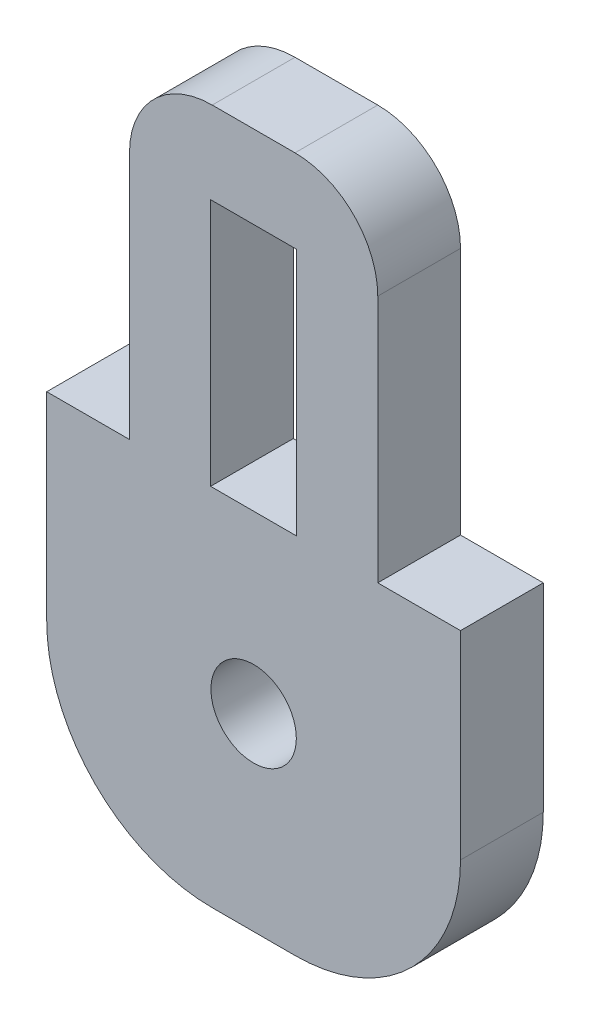
ISO-10303-21;
HEADER;
FILE_DESCRIPTION(('STEP AP214'),'2;1');
FILE_NAME('part.step','',(''),(''),'','','');
FILE_SCHEMA(('AUTOMOTIVE_DESIGN { 1 0 10303 214 1 1 1 1 }'));
ENDSEC;
DATA;
#1=APPLICATION_CONTEXT('core data for automotive mechanical design processes');
#2=APPLICATION_PROTOCOL_DEFINITION('international standard','automotive_design',2000,#1);
#3=PRODUCT_CONTEXT('',#1,'mechanical');
#4=PRODUCT('Part','Part','',(#3));
#5=PRODUCT_RELATED_PRODUCT_CATEGORY('part','',(#4));
#6=PRODUCT_DEFINITION_FORMATION('','',#4);
#7=PRODUCT_DEFINITION_CONTEXT('part definition',#1,'design');
#8=PRODUCT_DEFINITION('design','',#6,#7);
#9=PRODUCT_DEFINITION_SHAPE('','',#8);
#10=(LENGTH_UNIT() NAMED_UNIT(*) SI_UNIT(.MILLI.,.METRE.));
#11=(NAMED_UNIT(*) PLANE_ANGLE_UNIT() SI_UNIT($,.RADIAN.));
#12=(NAMED_UNIT(*) SI_UNIT($,.STERADIAN.) SOLID_ANGLE_UNIT());
#13=UNCERTAINTY_MEASURE_WITH_UNIT(LENGTH_MEASURE(1.E-05),#10,'distance_accuracy_value','');
#14=(GEOMETRIC_REPRESENTATION_CONTEXT(3) GLOBAL_UNCERTAINTY_ASSIGNED_CONTEXT((#13)) GLOBAL_UNIT_ASSIGNED_CONTEXT((#10,
#11,#12)) REPRESENTATION_CONTEXT('',''));
#15=CARTESIAN_POINT('',(0.,0.,0.));
#16=DIRECTION('',(0.,0.,1.));
#17=DIRECTION('',(1.,0.,0.));
#18=AXIS2_PLACEMENT_3D('',#15,#16,#17);
#19=CARTESIAN_POINT('',(-1.5875,16.51,3.175));
#20=DIRECTION('',(0.,0.,-1.));
#21=DIRECTION('',(-1.,0.,0.));
#22=AXIS2_PLACEMENT_3D('',#19,#20,#21);
#23=PLANE('',#22);
#24=DIRECTION('',(0.,1.,0.));
#25=VECTOR('',#24,1.);
#26=CARTESIAN_POINT('',(1.651,6.985,3.175));
#27=LINE('',#26,#25);
#28=CARTESIAN_POINT('',(1.651,6.985,3.175));
#29=VERTEX_POINT('',#28);
#30=CARTESIAN_POINT('',(1.651,16.51,3.175));
#31=VERTEX_POINT('',#30);
#32=EDGE_CURVE('E149',#29,#31,#27,.T.);
#33=ORIENTED_EDGE('',*,*,#32,.F.);
#34=DIRECTION('',(1.,0.,0.));
#35=VECTOR('',#34,1.);
#36=CARTESIAN_POINT('',(-1.651,6.985,3.175));
#37=LINE('',#36,#35);
#38=CARTESIAN_POINT('',(-1.651,6.985,3.175));
#39=VERTEX_POINT('',#38);
#40=EDGE_CURVE('E172',#39,#29,#37,.T.);
#41=ORIENTED_EDGE('',*,*,#40,.F.);
#42=DIRECTION('',(0.,-1.,0.));
#43=VECTOR('',#42,1.);
#44=CARTESIAN_POINT('',(-1.651,6.985,3.175));
#45=LINE('',#44,#43);
#46=CARTESIAN_POINT('',(-1.651,16.51,3.175));
#47=VERTEX_POINT('',#46);
#48=EDGE_CURVE('E170',#47,#39,#45,.T.);
#49=ORIENTED_EDGE('',*,*,#48,.F.);
#50=DIRECTION('',(-1.,0.,0.));
#51=VECTOR('',#50,1.);
#52=CARTESIAN_POINT('',(-1.651,16.51,3.175));
#53=LINE('',#52,#51);
#54=EDGE_CURVE('E157',#31,#47,#53,.T.);
#55=ORIENTED_EDGE('',*,*,#54,.F.);
#56=EDGE_LOOP('',(#33,#41,#49,#55));
#57=FACE_BOUND('',#56,.T.);
#58=DIRECTION('',(-1.,0.,0.));
#59=VECTOR('',#58,1.);
#60=CARTESIAN_POINT('',(-7.9375,6.985,3.175));
#61=LINE('',#60,#59);
#62=CARTESIAN_POINT('',(-4.7625,6.98499999999999,3.175));
#63=VERTEX_POINT('',#62);
#64=CARTESIAN_POINT('',(-7.9375,6.985,3.175));
#65=VERTEX_POINT('',#64);
#66=EDGE_CURVE('E201',#63,#65,#61,.T.);
#67=ORIENTED_EDGE('',*,*,#66,.T.);
#68=DIRECTION('',(0.,-1.,0.));
#69=VECTOR('',#68,1.);
#70=CARTESIAN_POINT('',(-7.9375,6.985,3.175));
#71=LINE('',#70,#69);
#72=CARTESIAN_POINT('',(-7.9375,-0.635000000000001,3.175));
#73=VERTEX_POINT('',#72);
#74=EDGE_CURVE('E204',#65,#73,#71,.T.);
#75=ORIENTED_EDGE('',*,*,#74,.T.);
#76=CARTESIAN_POINT('',(-1.5875,-0.635000000000001,3.175));
#77=DIRECTION('',(0.,0.,1.));
#78=DIRECTION('',(1.,0.,0.));
#79=AXIS2_PLACEMENT_3D('',#76,#77,#78);
#80=CIRCLE('',#79,6.35);
#81=CARTESIAN_POINT('',(-1.5875,-6.985,3.175));
#82=VERTEX_POINT('',#81);
#83=EDGE_CURVE('E207',#73,#82,#80,.T.);
#84=ORIENTED_EDGE('',*,*,#83,.T.);
#85=DIRECTION('',(1.,0.,0.));
#86=VECTOR('',#85,1.);
#87=CARTESIAN_POINT('',(-1.5875,-6.985,3.175));
#88=LINE('',#87,#86);
#89=CARTESIAN_POINT('',(1.5875,-6.985,3.175));
#90=VERTEX_POINT('',#89);
#91=EDGE_CURVE('E209',#82,#90,#88,.T.);
#92=ORIENTED_EDGE('',*,*,#91,.T.);
#93=CARTESIAN_POINT('',(1.5875,-0.635000000000001,3.175));
#94=DIRECTION('',(0.,0.,1.));
#95=DIRECTION('',(1.,0.,0.));
#96=AXIS2_PLACEMENT_3D('',#93,#94,#95);
#97=CIRCLE('',#96,6.35);
#98=CARTESIAN_POINT('',(7.9375,-0.635000000000001,3.175));
#99=VERTEX_POINT('',#98);
#100=EDGE_CURVE('E211',#90,#99,#97,.T.);
#101=ORIENTED_EDGE('',*,*,#100,.T.);
#102=DIRECTION('',(0.,1.,0.));
#103=VECTOR('',#102,1.);
#104=CARTESIAN_POINT('',(7.9375,6.985,3.175));
#105=LINE('',#104,#103);
#106=CARTESIAN_POINT('',(7.9375,6.985,3.175));
#107=VERTEX_POINT('',#106);
#108=EDGE_CURVE('E213',#99,#107,#105,.T.);
#109=ORIENTED_EDGE('',*,*,#108,.T.);
#110=DIRECTION('',(-1.,0.,0.));
#111=VECTOR('',#110,1.);
#112=CARTESIAN_POINT('',(7.9375,6.985,3.175));
#113=LINE('',#112,#111);
#114=CARTESIAN_POINT('',(4.7625,6.985,3.175));
#115=VERTEX_POINT('',#114);
#116=EDGE_CURVE('E215',#107,#115,#113,.T.);
#117=ORIENTED_EDGE('',*,*,#116,.T.);
#118=DIRECTION('',(0.,1.,0.));
#119=VECTOR('',#118,1.);
#120=CARTESIAN_POINT('',(4.7625,6.985,3.175));
#121=LINE('',#120,#119);
#122=CARTESIAN_POINT('',(4.7625,16.51,3.175));
#123=VERTEX_POINT('',#122);
#124=EDGE_CURVE('E217',#115,#123,#121,.T.);
#125=ORIENTED_EDGE('',*,*,#124,.T.);
#126=CARTESIAN_POINT('',(1.5875,16.51,3.175));
#127=DIRECTION('',(0.,0.,1.));
#128=DIRECTION('',(-1.,0.,0.));
#129=AXIS2_PLACEMENT_3D('',#126,#127,#128);
#130=CIRCLE('',#129,3.175);
#131=CARTESIAN_POINT('',(1.5875,19.685,3.175));
#132=VERTEX_POINT('',#131);
#133=EDGE_CURVE('E219',#123,#132,#130,.T.);
#134=ORIENTED_EDGE('',*,*,#133,.T.);
#135=DIRECTION('',(-1.,0.,0.));
#136=VECTOR('',#135,1.);
#137=CARTESIAN_POINT('',(-1.5875,19.685,3.175));
#138=LINE('',#137,#136);
#139=CARTESIAN_POINT('',(-1.5875,19.685,3.175));
#140=VERTEX_POINT('',#139);
#141=EDGE_CURVE('E221',#132,#140,#138,.T.);
#142=ORIENTED_EDGE('',*,*,#141,.T.);
#143=CARTESIAN_POINT('',(-1.5875,16.51,3.175));
#144=DIRECTION('',(0.,0.,1.));
#145=DIRECTION('',(-1.,0.,0.));
#146=AXIS2_PLACEMENT_3D('',#143,#144,#145);
#147=CIRCLE('',#146,3.175);
#148=CARTESIAN_POINT('',(-4.7625,16.51,3.175));
#149=VERTEX_POINT('',#148);
#150=EDGE_CURVE('E223',#140,#149,#147,.T.);
#151=ORIENTED_EDGE('',*,*,#150,.T.);
#152=DIRECTION('',(0.,-1.,0.));
#153=VECTOR('',#152,1.);
#154=CARTESIAN_POINT('',(-4.7625,6.98499999999999,3.175));
#155=LINE('',#154,#153);
#156=EDGE_CURVE('E225',#149,#63,#155,.T.);
#157=ORIENTED_EDGE('',*,*,#156,.T.);
#158=EDGE_LOOP('',(#67,#75,#84,#92,#101,#109,#117,#125,#134,#142,#151,#157));
#159=FACE_BOUND('',#158,.T.);
#160=CARTESIAN_POINT('',(0.,0.254000000000001,3.175));
#161=DIRECTION('',(0.,0.,1.));
#162=DIRECTION('',(1.,0.,0.));
#163=AXIS2_PLACEMENT_3D('',#160,#161,#162);
#164=CIRCLE('',#163,1.6383);
#165=CARTESIAN_POINT('',(1.6383,0.254000000000001,3.175));
#166=VERTEX_POINT('',#165);
#167=EDGE_CURVE('E179',#166,#166,#164,.T.);
#168=ORIENTED_EDGE('',*,*,#167,.F.);
#169=EDGE_LOOP('',(#168));
#170=FACE_BOUND('',#169,.T.);
#171=ADVANCED_FACE('F36',(#57,#159,#170),#23,.F.);
#172=CARTESIAN_POINT('',(-1.5875,16.51,0.));
#173=DIRECTION('',(0.,0.,-1.));
#174=DIRECTION('',(-1.,0.,0.));
#175=AXIS2_PLACEMENT_3D('',#172,#173,#174);
#176=PLANE('',#175);
#177=DIRECTION('',(1.,0.,0.));
#178=VECTOR('',#177,1.);
#179=CARTESIAN_POINT('',(-1.651,6.985,0.));
#180=LINE('',#179,#178);
#181=CARTESIAN_POINT('',(-1.651,6.985,0.));
#182=VERTEX_POINT('',#181);
#183=CARTESIAN_POINT('',(1.651,6.985,0.));
#184=VERTEX_POINT('',#183);
#185=EDGE_CURVE('E158',#182,#184,#180,.T.);
#186=ORIENTED_EDGE('',*,*,#185,.T.);
#187=DIRECTION('',(0.,1.,0.));
#188=VECTOR('',#187,1.);
#189=CARTESIAN_POINT('',(1.651,6.985,0.));
#190=LINE('',#189,#188);
#191=CARTESIAN_POINT('',(1.651,16.51,0.));
#192=VERTEX_POINT('',#191);
#193=EDGE_CURVE('E59',#184,#192,#190,.T.);
#194=ORIENTED_EDGE('',*,*,#193,.T.);
#195=DIRECTION('',(-1.,0.,0.));
#196=VECTOR('',#195,1.);
#197=CARTESIAN_POINT('',(-1.651,16.51,0.));
#198=LINE('',#197,#196);
#199=CARTESIAN_POINT('',(-1.651,16.51,0.));
#200=VERTEX_POINT('',#199);
#201=EDGE_CURVE('E164',#192,#200,#198,.T.);
#202=ORIENTED_EDGE('',*,*,#201,.T.);
#203=DIRECTION('',(0.,-1.,0.));
#204=VECTOR('',#203,1.);
#205=CARTESIAN_POINT('',(-1.651,6.985,0.));
#206=LINE('',#205,#204);
#207=EDGE_CURVE('E190',#200,#182,#206,.T.);
#208=ORIENTED_EDGE('',*,*,#207,.T.);
#209=EDGE_LOOP('',(#186,#194,#202,#208));
#210=FACE_BOUND('',#209,.T.);
#211=DIRECTION('',(-1.,0.,0.));
#212=VECTOR('',#211,1.);
#213=CARTESIAN_POINT('',(-7.9375,6.985,0.));
#214=LINE('',#213,#212);
#215=CARTESIAN_POINT('',(-4.7625,6.98499999999999,0.));
#216=VERTEX_POINT('',#215);
#217=CARTESIAN_POINT('',(-7.9375,6.985,0.));
#218=VERTEX_POINT('',#217);
#219=EDGE_CURVE('E165',#216,#218,#214,.T.);
#220=ORIENTED_EDGE('',*,*,#219,.F.);
#221=DIRECTION('',(0.,-1.,0.));
#222=VECTOR('',#221,1.);
#223=CARTESIAN_POINT('',(-4.7625,6.98499999999999,0.));
#224=LINE('',#223,#222);
#225=CARTESIAN_POINT('',(-4.7625,16.51,0.));
#226=VERTEX_POINT('',#225);
#227=EDGE_CURVE('E205',#226,#216,#224,.T.);
#228=ORIENTED_EDGE('',*,*,#227,.F.);
#229=CARTESIAN_POINT('',(-1.5875,16.51,0.));
#230=DIRECTION('',(0.,0.,1.));
#231=DIRECTION('',(-1.,0.,0.));
#232=AXIS2_PLACEMENT_3D('',#229,#230,#231);
#233=CIRCLE('',#232,3.175);
#234=CARTESIAN_POINT('',(-1.5875,19.685,0.));
#235=VERTEX_POINT('',#234);
#236=EDGE_CURVE('E273',#235,#226,#233,.T.);
#237=ORIENTED_EDGE('',*,*,#236,.F.);
#238=DIRECTION('',(-1.,0.,0.));
#239=VECTOR('',#238,1.);
#240=CARTESIAN_POINT('',(-1.5875,19.685,0.));
#241=LINE('',#240,#239);
#242=CARTESIAN_POINT('',(1.5875,19.685,0.));
#243=VERTEX_POINT('',#242);
#244=EDGE_CURVE('E269',#243,#235,#241,.T.);
#245=ORIENTED_EDGE('',*,*,#244,.F.);
#246=CARTESIAN_POINT('',(1.5875,16.51,0.));
#247=DIRECTION('',(0.,0.,1.));
#248=DIRECTION('',(-1.,0.,0.));
#249=AXIS2_PLACEMENT_3D('',#246,#247,#248);
#250=CIRCLE('',#249,3.175);
#251=CARTESIAN_POINT('',(4.7625,16.51,0.));
#252=VERTEX_POINT('',#251);
#253=EDGE_CURVE('E265',#252,#243,#250,.T.);
#254=ORIENTED_EDGE('',*,*,#253,.F.);
#255=DIRECTION('',(0.,1.,0.));
#256=VECTOR('',#255,1.);
#257=CARTESIAN_POINT('',(4.7625,6.985,0.));
#258=LINE('',#257,#256);
#259=CARTESIAN_POINT('',(4.7625,6.985,0.));
#260=VERTEX_POINT('',#259);
#261=EDGE_CURVE('E262',#260,#252,#258,.T.);
#262=ORIENTED_EDGE('',*,*,#261,.F.);
#263=DIRECTION('',(-1.,0.,0.));
#264=VECTOR('',#263,1.);
#265=CARTESIAN_POINT('',(7.9375,6.985,0.));
#266=LINE('',#265,#264);
#267=CARTESIAN_POINT('',(7.9375,6.985,0.));
#268=VERTEX_POINT('',#267);
#269=EDGE_CURVE('E254',#268,#260,#266,.T.);
#270=ORIENTED_EDGE('',*,*,#269,.F.);
#271=DIRECTION('',(0.,1.,0.));
#272=VECTOR('',#271,1.);
#273=CARTESIAN_POINT('',(7.9375,6.985,0.));
#274=LINE('',#273,#272);
#275=CARTESIAN_POINT('',(7.9375,-0.635000000000001,0.));
#276=VERTEX_POINT('',#275);
#277=EDGE_CURVE('E250',#276,#268,#274,.T.);
#278=ORIENTED_EDGE('',*,*,#277,.F.);
#279=CARTESIAN_POINT('',(1.5875,-0.635000000000001,0.));
#280=DIRECTION('',(0.,0.,1.));
#281=DIRECTION('',(1.,0.,0.));
#282=AXIS2_PLACEMENT_3D('',#279,#280,#281);
#283=CIRCLE('',#282,6.35);
#284=CARTESIAN_POINT('',(1.5875,-6.985,0.));
#285=VERTEX_POINT('',#284);
#286=EDGE_CURVE('E246',#285,#276,#283,.T.);
#287=ORIENTED_EDGE('',*,*,#286,.F.);
#288=DIRECTION('',(1.,0.,0.));
#289=VECTOR('',#288,1.);
#290=CARTESIAN_POINT('',(-1.5875,-6.985,0.));
#291=LINE('',#290,#289);
#292=CARTESIAN_POINT('',(-1.5875,-6.985,0.));
#293=VERTEX_POINT('',#292);
#294=EDGE_CURVE('E243',#293,#285,#291,.T.);
#295=ORIENTED_EDGE('',*,*,#294,.F.);
#296=CARTESIAN_POINT('',(-1.5875,-0.635000000000001,0.));
#297=DIRECTION('',(0.,0.,1.));
#298=DIRECTION('',(1.,0.,0.));
#299=AXIS2_PLACEMENT_3D('',#296,#297,#298);
#300=CIRCLE('',#299,6.35);
#301=CARTESIAN_POINT('',(-7.9375,-0.635000000000001,0.));
#302=VERTEX_POINT('',#301);
#303=EDGE_CURVE('E235',#302,#293,#300,.T.);
#304=ORIENTED_EDGE('',*,*,#303,.F.);
#305=DIRECTION('',(0.,-1.,0.));
#306=VECTOR('',#305,1.);
#307=CARTESIAN_POINT('',(-7.9375,6.985,0.));
#308=LINE('',#307,#306);
#309=EDGE_CURVE('E231',#218,#302,#308,.T.);
#310=ORIENTED_EDGE('',*,*,#309,.F.);
#311=EDGE_LOOP('',(#220,#228,#237,#245,#254,#262,#270,#278,#287,#295,#304,#310));
#312=FACE_BOUND('',#311,.T.);
#313=CARTESIAN_POINT('',(0.,0.254000000000001,0.));
#314=DIRECTION('',(0.,0.,1.));
#315=DIRECTION('',(1.,0.,0.));
#316=AXIS2_PLACEMENT_3D('',#313,#314,#315);
#317=CIRCLE('',#316,1.6383);
#318=CARTESIAN_POINT('',(1.6383,0.254000000000001,0.));
#319=VERTEX_POINT('',#318);
#320=EDGE_CURVE('E324',#319,#319,#317,.T.);
#321=ORIENTED_EDGE('',*,*,#320,.T.);
#322=EDGE_LOOP('',(#321));
#323=FACE_BOUND('',#322,.T.);
#324=ADVANCED_FACE('F319',(#210,#312,#323),#176,.T.);
#325=CARTESIAN_POINT('',(-7.9375,6.985,3.175));
#326=DIRECTION('',(0.,-1.,0.));
#327=DIRECTION('',(1.,0.,0.));
#328=AXIS2_PLACEMENT_3D('',#325,#326,#327);
#329=PLANE('',#328);
#330=ORIENTED_EDGE('',*,*,#219,.T.);
#331=DIRECTION('',(0.,0.,-1.));
#332=VECTOR('',#331,1.);
#333=CARTESIAN_POINT('',(-7.9375,6.985,3.175));
#334=LINE('',#333,#332);
#335=EDGE_CURVE('E12',#65,#218,#334,.T.);
#336=ORIENTED_EDGE('',*,*,#335,.F.);
#337=ORIENTED_EDGE('',*,*,#66,.F.);
#338=DIRECTION('',(0.,0.,-1.));
#339=VECTOR('',#338,1.);
#340=CARTESIAN_POINT('',(-4.7625,6.98499999999999,3.175));
#341=LINE('',#340,#339);
#342=EDGE_CURVE('E226',#63,#216,#341,.T.);
#343=ORIENTED_EDGE('',*,*,#342,.T.);
#344=EDGE_LOOP('',(#330,#336,#337,#343));
#345=FACE_BOUND('',#344,.T.);
#346=ADVANCED_FACE('F38',(#345),#329,.F.);
#347=CARTESIAN_POINT('',(-7.9375,6.985,3.175));
#348=DIRECTION('',(1.,0.,0.));
#349=DIRECTION('',(0.,0.,-1.));
#350=AXIS2_PLACEMENT_3D('',#347,#348,#349);
#351=PLANE('',#350);
#352=ORIENTED_EDGE('',*,*,#309,.T.);
#353=DIRECTION('',(0.,0.,-1.));
#354=VECTOR('',#353,1.);
#355=CARTESIAN_POINT('',(-7.9375,-0.635000000000001,3.175));
#356=LINE('',#355,#354);
#357=EDGE_CURVE('E44',#73,#302,#356,.T.);
#358=ORIENTED_EDGE('',*,*,#357,.F.);
#359=ORIENTED_EDGE('',*,*,#74,.F.);
#360=ORIENTED_EDGE('',*,*,#335,.T.);
#361=EDGE_LOOP('',(#352,#358,#359,#360));
#362=FACE_BOUND('',#361,.T.);
#363=ADVANCED_FACE('F382',(#362),#351,.F.);
#364=CARTESIAN_POINT('',(-1.5875,-0.635000000000001,3.175));
#365=DIRECTION('',(0.,0.,-1.));
#366=DIRECTION('',(-1.,0.,0.));
#367=AXIS2_PLACEMENT_3D('',#364,#365,#366);
#368=CYLINDRICAL_SURFACE('',#367,6.35);
#369=ORIENTED_EDGE('',*,*,#303,.T.);
#370=DIRECTION('',(0.,0.,-1.));
#371=VECTOR('',#370,1.);
#372=CARTESIAN_POINT('',(-1.5875,-6.985,3.175));
#373=LINE('',#372,#371);
#374=EDGE_CURVE('E306',#82,#293,#373,.T.);
#375=ORIENTED_EDGE('',*,*,#374,.F.);
#376=ORIENTED_EDGE('',*,*,#83,.F.);
#377=ORIENTED_EDGE('',*,*,#357,.T.);
#378=EDGE_LOOP('',(#369,#375,#376,#377));
#379=FACE_BOUND('',#378,.T.);
#380=ADVANCED_FACE('F313',(#379),#368,.T.);
#381=CARTESIAN_POINT('',(-1.5875,-6.985,3.175));
#382=DIRECTION('',(0.,1.,0.));
#383=DIRECTION('',(0.,0.,1.));
#384=AXIS2_PLACEMENT_3D('',#381,#382,#383);
#385=PLANE('',#384);
#386=ORIENTED_EDGE('',*,*,#294,.T.);
#387=DIRECTION('',(0.,0.,-1.));
#388=VECTOR('',#387,1.);
#389=CARTESIAN_POINT('',(1.5875,-6.985,3.175));
#390=LINE('',#389,#388);
#391=EDGE_CURVE('E303',#90,#285,#390,.T.);
#392=ORIENTED_EDGE('',*,*,#391,.F.);
#393=ORIENTED_EDGE('',*,*,#91,.F.);
#394=ORIENTED_EDGE('',*,*,#374,.T.);
#395=EDGE_LOOP('',(#386,#392,#393,#394));
#396=FACE_BOUND('',#395,.T.);
#397=ADVANCED_FACE('F376',(#396),#385,.F.);
#398=CARTESIAN_POINT('',(1.5875,-0.635000000000001,3.175));
#399=DIRECTION('',(0.,0.,-1.));
#400=DIRECTION('',(-1.,0.,0.));
#401=AXIS2_PLACEMENT_3D('',#398,#399,#400);
#402=CYLINDRICAL_SURFACE('',#401,6.35);
#403=ORIENTED_EDGE('',*,*,#286,.T.);
#404=DIRECTION('',(0.,0.,-1.));
#405=VECTOR('',#404,1.);
#406=CARTESIAN_POINT('',(7.9375,-0.635000000000001,3.175));
#407=LINE('',#406,#405);
#408=EDGE_CURVE('E300',#99,#276,#407,.T.);
#409=ORIENTED_EDGE('',*,*,#408,.F.);
#410=ORIENTED_EDGE('',*,*,#100,.F.);
#411=ORIENTED_EDGE('',*,*,#391,.T.);
#412=EDGE_LOOP('',(#403,#409,#410,#411));
#413=FACE_BOUND('',#412,.T.);
#414=ADVANCED_FACE('F372',(#413),#402,.T.);
#415=CARTESIAN_POINT('',(7.9375,6.985,3.175));
#416=DIRECTION('',(-1.,0.,0.));
#417=DIRECTION('',(0.,0.,1.));
#418=AXIS2_PLACEMENT_3D('',#415,#416,#417);
#419=PLANE('',#418);
#420=ORIENTED_EDGE('',*,*,#277,.T.);
#421=DIRECTION('',(0.,0.,-1.));
#422=VECTOR('',#421,1.);
#423=CARTESIAN_POINT('',(7.9375,6.985,3.175));
#424=LINE('',#423,#422);
#425=EDGE_CURVE('E297',#107,#268,#424,.T.);
#426=ORIENTED_EDGE('',*,*,#425,.F.);
#427=ORIENTED_EDGE('',*,*,#108,.F.);
#428=ORIENTED_EDGE('',*,*,#408,.T.);
#429=EDGE_LOOP('',(#420,#426,#427,#428));
#430=FACE_BOUND('',#429,.T.);
#431=ADVANCED_FACE('F368',(#430),#419,.F.);
#432=CARTESIAN_POINT('',(7.9375,6.985,3.175));
#433=DIRECTION('',(0.,-1.,0.));
#434=DIRECTION('',(1.,0.,0.));
#435=AXIS2_PLACEMENT_3D('',#432,#433,#434);
#436=PLANE('',#435);
#437=ORIENTED_EDGE('',*,*,#269,.T.);
#438=DIRECTION('',(0.,0.,-1.));
#439=VECTOR('',#438,1.);
#440=CARTESIAN_POINT('',(4.7625,6.985,3.175));
#441=LINE('',#440,#439);
#442=EDGE_CURVE('E294',#115,#260,#441,.T.);
#443=ORIENTED_EDGE('',*,*,#442,.F.);
#444=ORIENTED_EDGE('',*,*,#116,.F.);
#445=ORIENTED_EDGE('',*,*,#425,.T.);
#446=EDGE_LOOP('',(#437,#443,#444,#445));
#447=FACE_BOUND('',#446,.T.);
#448=ADVANCED_FACE('F364',(#447),#436,.F.);
#449=CARTESIAN_POINT('',(4.7625,6.985,3.175));
#450=DIRECTION('',(-1.,0.,0.));
#451=DIRECTION('',(0.,-1.,0.));
#452=AXIS2_PLACEMENT_3D('',#449,#450,#451);
#453=PLANE('',#452);
#454=ORIENTED_EDGE('',*,*,#261,.T.);
#455=DIRECTION('',(0.,0.,-1.));
#456=VECTOR('',#455,1.);
#457=CARTESIAN_POINT('',(4.7625,16.51,3.175));
#458=LINE('',#457,#456);
#459=EDGE_CURVE('E291',#123,#252,#458,.T.);
#460=ORIENTED_EDGE('',*,*,#459,.F.);
#461=ORIENTED_EDGE('',*,*,#124,.F.);
#462=ORIENTED_EDGE('',*,*,#442,.T.);
#463=EDGE_LOOP('',(#454,#460,#461,#462));
#464=FACE_BOUND('',#463,.T.);
#465=ADVANCED_FACE('F360',(#464),#453,.F.);
#466=CARTESIAN_POINT('',(1.5875,16.51,3.175));
#467=DIRECTION('',(0.,0.,-1.));
#468=DIRECTION('',(-1.,0.,0.));
#469=AXIS2_PLACEMENT_3D('',#466,#467,#468);
#470=CYLINDRICAL_SURFACE('',#469,3.175);
#471=ORIENTED_EDGE('',*,*,#253,.T.);
#472=DIRECTION('',(0.,0.,-1.));
#473=VECTOR('',#472,1.);
#474=CARTESIAN_POINT('',(1.5875,19.685,3.175));
#475=LINE('',#474,#473);
#476=EDGE_CURVE('E288',#132,#243,#475,.T.);
#477=ORIENTED_EDGE('',*,*,#476,.F.);
#478=ORIENTED_EDGE('',*,*,#133,.F.);
#479=ORIENTED_EDGE('',*,*,#459,.T.);
#480=EDGE_LOOP('',(#471,#477,#478,#479));
#481=FACE_BOUND('',#480,.T.);
#482=ADVANCED_FACE('F356',(#481),#470,.T.);
#483=CARTESIAN_POINT('',(-1.5875,19.685,3.175));
#484=DIRECTION('',(0.,-1.,0.));
#485=DIRECTION('',(0.,0.,-1.));
#486=AXIS2_PLACEMENT_3D('',#483,#484,#485);
#487=PLANE('',#486);
#488=ORIENTED_EDGE('',*,*,#244,.T.);
#489=DIRECTION('',(0.,0.,-1.));
#490=VECTOR('',#489,1.);
#491=CARTESIAN_POINT('',(-1.5875,19.685,3.175));
#492=LINE('',#491,#490);
#493=EDGE_CURVE('E285',#140,#235,#492,.T.);
#494=ORIENTED_EDGE('',*,*,#493,.F.);
#495=ORIENTED_EDGE('',*,*,#141,.F.);
#496=ORIENTED_EDGE('',*,*,#476,.T.);
#497=EDGE_LOOP('',(#488,#494,#495,#496));
#498=FACE_BOUND('',#497,.T.);
#499=ADVANCED_FACE('F352',(#498),#487,.F.);
#500=CARTESIAN_POINT('',(-1.5875,16.51,3.175));
#501=DIRECTION('',(0.,0.,-1.));
#502=DIRECTION('',(-1.,0.,0.));
#503=AXIS2_PLACEMENT_3D('',#500,#501,#502);
#504=CYLINDRICAL_SURFACE('',#503,3.175);
#505=ORIENTED_EDGE('',*,*,#236,.T.);
#506=DIRECTION('',(0.,0.,-1.));
#507=VECTOR('',#506,1.);
#508=CARTESIAN_POINT('',(-4.7625,16.51,3.175));
#509=LINE('',#508,#507);
#510=EDGE_CURVE('E282',#149,#226,#509,.T.);
#511=ORIENTED_EDGE('',*,*,#510,.F.);
#512=ORIENTED_EDGE('',*,*,#150,.F.);
#513=ORIENTED_EDGE('',*,*,#493,.T.);
#514=EDGE_LOOP('',(#505,#511,#512,#513));
#515=FACE_BOUND('',#514,.T.);
#516=ADVANCED_FACE('F348',(#515),#504,.T.);
#517=CARTESIAN_POINT('',(-4.7625,6.98499999999999,3.175));
#518=DIRECTION('',(1.,0.,0.));
#519=DIRECTION('',(0.,0.,-1.));
#520=AXIS2_PLACEMENT_3D('',#517,#518,#519);
#521=PLANE('',#520);
#522=ORIENTED_EDGE('',*,*,#227,.T.);
#523=ORIENTED_EDGE('',*,*,#342,.F.);
#524=ORIENTED_EDGE('',*,*,#156,.F.);
#525=ORIENTED_EDGE('',*,*,#510,.T.);
#526=EDGE_LOOP('',(#522,#523,#524,#525));
#527=FACE_BOUND('',#526,.T.);
#528=ADVANCED_FACE('F345',(#527),#521,.F.);
#529=CARTESIAN_POINT('',(1.651,6.985,3.175));
#530=DIRECTION('',(-1.,0.,0.));
#531=DIRECTION('',(0.,0.,1.));
#532=AXIS2_PLACEMENT_3D('',#529,#530,#531);
#533=PLANE('',#532);
#534=ORIENTED_EDGE('',*,*,#193,.F.);
#535=DIRECTION('',(0.,0.,-1.));
#536=VECTOR('',#535,1.);
#537=CARTESIAN_POINT('',(1.651,6.985,3.175));
#538=LINE('',#537,#536);
#539=EDGE_CURVE('E153',#29,#184,#538,.T.);
#540=ORIENTED_EDGE('',*,*,#539,.F.);
#541=ORIENTED_EDGE('',*,*,#32,.T.);
#542=DIRECTION('',(0.,0.,-1.));
#543=VECTOR('',#542,1.);
#544=CARTESIAN_POINT('',(1.651,16.51,3.175));
#545=LINE('',#544,#543);
#546=EDGE_CURVE('E152',#31,#192,#545,.T.);
#547=ORIENTED_EDGE('',*,*,#546,.T.);
#548=EDGE_LOOP('',(#534,#540,#541,#547));
#549=FACE_BOUND('',#548,.T.);
#550=ADVANCED_FACE('F151',(#549),#533,.T.);
#551=CARTESIAN_POINT('',(-1.651,16.51,3.175));
#552=DIRECTION('',(0.,-1.,0.));
#553=DIRECTION('',(0.,0.,-1.));
#554=AXIS2_PLACEMENT_3D('',#551,#552,#553);
#555=PLANE('',#554);
#556=ORIENTED_EDGE('',*,*,#201,.F.);
#557=ORIENTED_EDGE('',*,*,#546,.F.);
#558=ORIENTED_EDGE('',*,*,#54,.T.);
#559=DIRECTION('',(0.,0.,-1.));
#560=VECTOR('',#559,1.);
#561=CARTESIAN_POINT('',(-1.651,16.51,3.175));
#562=LINE('',#561,#560);
#563=EDGE_CURVE('E166',#47,#200,#562,.T.);
#564=ORIENTED_EDGE('',*,*,#563,.T.);
#565=EDGE_LOOP('',(#556,#557,#558,#564));
#566=FACE_BOUND('',#565,.T.);
#567=ADVANCED_FACE('F161',(#566),#555,.T.);
#568=CARTESIAN_POINT('',(-1.651,6.985,3.175));
#569=DIRECTION('',(1.,0.,0.));
#570=DIRECTION('',(0.,0.,-1.));
#571=AXIS2_PLACEMENT_3D('',#568,#569,#570);
#572=PLANE('',#571);
#573=ORIENTED_EDGE('',*,*,#207,.F.);
#574=ORIENTED_EDGE('',*,*,#563,.F.);
#575=ORIENTED_EDGE('',*,*,#48,.T.);
#576=DIRECTION('',(0.,0.,-1.));
#577=VECTOR('',#576,1.);
#578=CARTESIAN_POINT('',(-1.651,6.985,3.175));
#579=LINE('',#578,#577);
#580=EDGE_CURVE('E51',#39,#182,#579,.T.);
#581=ORIENTED_EDGE('',*,*,#580,.T.);
#582=EDGE_LOOP('',(#573,#574,#575,#581));
#583=FACE_BOUND('',#582,.T.);
#584=ADVANCED_FACE('F421',(#583),#572,.T.);
#585=CARTESIAN_POINT('',(-1.651,6.985,3.175));
#586=DIRECTION('',(0.,1.,0.));
#587=DIRECTION('',(0.,0.,1.));
#588=AXIS2_PLACEMENT_3D('',#585,#586,#587);
#589=PLANE('',#588);
#590=ORIENTED_EDGE('',*,*,#185,.F.);
#591=ORIENTED_EDGE('',*,*,#580,.F.);
#592=ORIENTED_EDGE('',*,*,#40,.T.);
#593=ORIENTED_EDGE('',*,*,#539,.T.);
#594=EDGE_LOOP('',(#590,#591,#592,#593));
#595=FACE_BOUND('',#594,.T.);
#596=ADVANCED_FACE('F419',(#595),#589,.T.);
#597=CARTESIAN_POINT('',(0.,0.254000000000001,3.175));
#598=DIRECTION('',(0.,0.,-1.));
#599=DIRECTION('',(-1.,0.,0.));
#600=AXIS2_PLACEMENT_3D('',#597,#598,#599);
#601=CYLINDRICAL_SURFACE('',#600,1.6383);
#602=ORIENTED_EDGE('',*,*,#167,.T.);
#603=EDGE_LOOP('',(#602));
#604=FACE_BOUND('',#603,.T.);
#605=ORIENTED_EDGE('',*,*,#320,.F.);
#606=EDGE_LOOP('',(#605));
#607=FACE_BOUND('',#606,.T.);
#608=ADVANCED_FACE('F332',(#604,#607),#601,.F.);
#609=CLOSED_SHELL('',(#171,#324,#346,#363,#380,#397,#414,#431,#448,#465,#482,#499,#516,#528,
#550,#567,#584,#596,#608));
#610=MANIFOLD_SOLID_BREP('B2',#609);
#611=ADVANCED_BREP_SHAPE_REPRESENTATION('',(#18,#610),#14);
#612=SHAPE_DEFINITION_REPRESENTATION(#9,#611);
ENDSEC;
END-ISO-10303-21;
